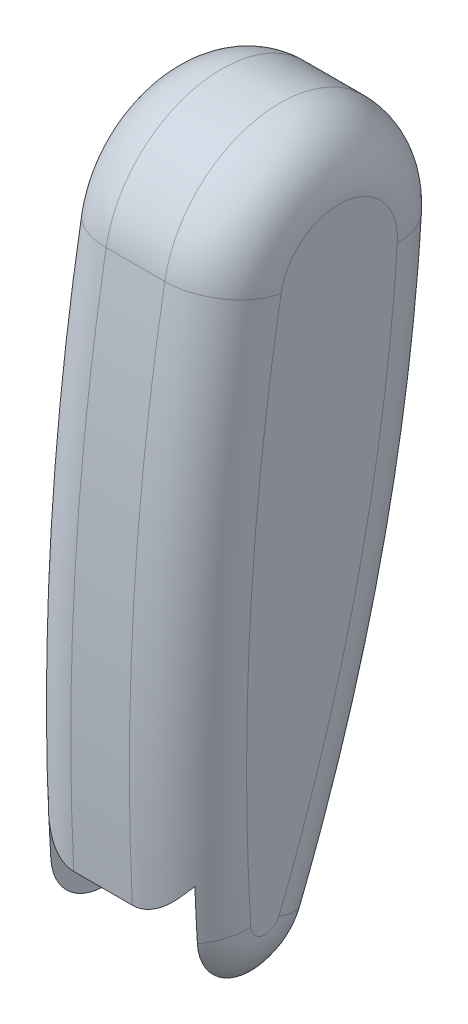
ISO-10303-21;
HEADER;
FILE_DESCRIPTION(('STEP AP214'),'2;1');
FILE_NAME('part.step','',(''),(''),'','','');
FILE_SCHEMA(('AUTOMOTIVE_DESIGN { 1 0 10303 214 1 1 1 1 }'));
ENDSEC;
DATA;
#1=APPLICATION_CONTEXT('core data for automotive mechanical design processes');
#2=APPLICATION_PROTOCOL_DEFINITION('international standard','automotive_design',2000,#1);
#3=PRODUCT_CONTEXT('',#1,'mechanical');
#4=PRODUCT('Part','Part','',(#3));
#5=PRODUCT_RELATED_PRODUCT_CATEGORY('part','',(#4));
#6=PRODUCT_DEFINITION_FORMATION('','',#4);
#7=PRODUCT_DEFINITION_CONTEXT('part definition',#1,'design');
#8=PRODUCT_DEFINITION('design','',#6,#7);
#9=PRODUCT_DEFINITION_SHAPE('','',#8);
#10=(LENGTH_UNIT() NAMED_UNIT(*) SI_UNIT(.MILLI.,.METRE.));
#11=(NAMED_UNIT(*) PLANE_ANGLE_UNIT() SI_UNIT($,.RADIAN.));
#12=(NAMED_UNIT(*) SI_UNIT($,.STERADIAN.) SOLID_ANGLE_UNIT());
#13=UNCERTAINTY_MEASURE_WITH_UNIT(LENGTH_MEASURE(1.E-05),#10,'distance_accuracy_value','');
#14=(GEOMETRIC_REPRESENTATION_CONTEXT(3) GLOBAL_UNCERTAINTY_ASSIGNED_CONTEXT((#13)) GLOBAL_UNIT_ASSIGNED_CONTEXT((#10,
#11,#12)) REPRESENTATION_CONTEXT('',''));
#15=CARTESIAN_POINT('',(0.,0.,0.));
#16=DIRECTION('',(0.,0.,1.));
#17=DIRECTION('',(1.,0.,0.));
#18=AXIS2_PLACEMENT_3D('',#15,#16,#17);
#19=CARTESIAN_POINT('',(139.7,-755.712320858886,11.4632188121573));
#20=DIRECTION('',(0.,1.,0.));
#21=DIRECTION('',(3.07606084086594E-13,0.,-1.));
#22=AXIS2_PLACEMENT_3D('',#19,#20,#21);
#23=CIRCLE('',#22,50.8000000000003);
#24=TRIMMED_CURVE('',#23,(PARAMETER_VALUE(-1.82347658193695)),
(PARAMETER_VALUE(1.82347658193694)),.T.,.PARAMETER.);
#25=CARTESIAN_POINT('',(139.699999999996,-755.712320858886,24.1632188121559));
#26=DIRECTION('',(1.,0.,3.07626936859255E-13));
#27=AXIS1_PLACEMENT('',#25,#26);
#28=SURFACE_OF_REVOLUTION('',#24,#27);
#29=CARTESIAN_POINT('',(190.499999999996,-755.712320858882,24.1632188121716));
#30=DIRECTION('',(-1.,0.,-3.07626936859255E-13));
#31=DIRECTION('',(3.1470888886976E-13,-0.371592184444044,-0.928396062281666));
#32=AXIS2_PLACEMENT_3D('',#29,#30,#31);
#33=CIRCLE('',#32,12.7000000000146);
#34=CARTESIAN_POINT('',(190.499999999999,-756.478427086324,36.8400907152899));
#35=VERTEX_POINT('',#34);
#36=CARTESIAN_POINT('',(190.5,-760.431541601326,12.3725888211803));
#37=VERTEX_POINT('',#36);
#38=EDGE_CURVE('E114',#35,#37,#33,.F.);
#39=ORIENTED_EDGE('',*,*,#38,.F.);
#40=CARTESIAN_POINT('',(139.7,-756.478427086324,36.8400907152838));
#41=DIRECTION('',(0.,0.998178890009972,0.060323324995071));
#42=DIRECTION('',(0.,-0.060323324995071,0.998178890009972));
#43=AXIS2_PLACEMENT_3D('',#40,#41,#42);
#44=CIRCLE('',#43,50.8000000000001);
#45=CARTESIAN_POINT('',(177.800000000007,-758.505353641979,70.3799411731736));
#46=VERTEX_POINT('',#45);
#47=EDGE_CURVE('E271',#46,#35,#44,.T.);
#48=ORIENTED_EDGE('',*,*,#47,.F.);
#49=CARTESIAN_POINT('',(177.800000000014,-755.712320858883,24.1632188121676));
#50=DIRECTION('',(1.,0.,3.07626936859255E-13));
#51=DIRECTION('',(3.07626936859255E-13,0.,-1.));
#52=AXIS2_PLACEMENT_3D('',#49,#50,#51);
#53=CIRCLE('',#52,46.3010416504991);
#54=CARTESIAN_POINT('',(177.800000000015,-772.917426067832,-18.8224859357094));
#55=VERTEX_POINT('',#54);
#56=EDGE_CURVE('E20',#46,#55,#53,.T.);
#57=ORIENTED_EDGE('',*,*,#56,.T.);
#58=CARTESIAN_POINT('',(139.7,-760.431541601325,12.3725888211803));
#59=DIRECTION('',(0.,0.928396062281659,-0.371592184444062));
#60=DIRECTION('',(0.,0.371592184444062,0.928396062281659));
#61=AXIS2_PLACEMENT_3D('',#58,#59,#60);
#62=CIRCLE('',#61,50.7999999999999);
#63=EDGE_CURVE('E296',#37,#55,#62,.T.);
#64=ORIENTED_EDGE('',*,*,#63,.F.);
#65=EDGE_LOOP('',(#39,#48,#57,#64));
#66=FACE_BOUND('',#65,.T.);
#67=ADVANCED_FACE('F16',(#66),#28,.F.);
#68=CARTESIAN_POINT('',(190.5,-794.216454076842,-96.8024627854969));
#69=DIRECTION('',(1.,0.,0.));
#70=DIRECTION('',(0.,0.,-1.));
#71=AXIS2_PLACEMENT_3D('',#68,#69,#70);
#72=PLANE('',#71);
#73=CARTESIAN_POINT('',(190.5,-756.478427086324,36.8400907152842));
#74=CARTESIAN_POINT('',(190.499999999999,-751.504785552898,37.1406646916831));
#75=CARTESIAN_POINT('',(190.500000000001,-746.530010340959,37.422479705629));
#76=CARTESIAN_POINT('',(190.499999999996,-736.57847566089,37.9485763175267));
#77=CARTESIAN_POINT('',(190.49999999999,-731.601716192753,38.1928579153289));
#78=CARTESIAN_POINT('',(190.499999999958,-721.646496056371,38.643872205279));
#79=CARTESIAN_POINT('',(190.499999999933,-716.668035388097,38.8506048967902));
#80=CARTESIAN_POINT('',(190.499999999804,-706.70969625621,39.2265154417653));
#81=CARTESIAN_POINT('',(190.499999999702,-701.729817792554,39.3956932941053));
#82=CARTESIAN_POINT('',(190.499999999467,-691.768925411853,39.6964628187845));
#83=CARTESIAN_POINT('',(190.499999999336,-686.787911494702,39.8280544876358));
#84=CARTESIAN_POINT('',(190.499999999232,-676.825032072229,40.0536224787717));
#85=CARTESIAN_POINT('',(190.499999999261,-671.843166566918,40.1475988015829));
#86=CARTESIAN_POINT('',(190.49999999944,-661.87886830955,40.2979363249625));
#87=CARTESIAN_POINT('',(190.499999999591,-656.896435557522,40.3542975275197));
#88=CARTESIAN_POINT('',(190.49999999986,-646.931286993145,40.4294009123427));
#89=CARTESIAN_POINT('',(190.499999999977,-641.948571180821,40.4481430980598));
#90=CARTESIAN_POINT('',(190.5,-636.965855606091,40.4480738275281));
#91=B_SPLINE_CURVE_WITH_KNOTS('',3,(#73,#74,#75,#76,#77,#78,#79,#80,#81,#82,#83,#84,#85,#86,#87,
#88,#89,#90),.UNSPECIFIED.,.F.,.F.,(4,2,2,2,2,2,2,2,4),(0.,14.9481114037877,29.8962228671435,
44.8443345839418,59.7924467480504,74.7405602993166,89.6886736413728,104.636786193134,
119.584897373515),.UNSPECIFIED.);
#92=CARTESIAN_POINT('',(190.5,-636.965855606091,40.4480738275281));
#93=VERTEX_POINT('',#92);
#94=EDGE_CURVE('E328',#35,#93,#91,.T.);
#95=ORIENTED_EDGE('',*,*,#94,.F.);
#96=ORIENTED_EDGE('',*,*,#38,.T.);
#97=CARTESIAN_POINT('',(190.5,-306.174610699949,-90.1650226153994));
#98=CARTESIAN_POINT('',(190.499999999997,-309.70473013733,-89.9413122228739));
#99=CARTESIAN_POINT('',(190.5,-313.234044049411,-89.7048925648984));
#100=CARTESIAN_POINT('',(190.499999999996,-320.290878148312,-89.2066479253229));
#101=CARTESIAN_POINT('',(190.499999999988,-323.818398335129,-88.9448229436801));
#102=CARTESIAN_POINT('',(190.49999999994,-330.871462375613,-88.3957808586758));
#103=CARTESIAN_POINT('',(190.499999999899,-334.397006229235,-88.108563754748));
#104=CARTESIAN_POINT('',(190.499999999734,-341.445933821868,-87.5087528258529));
#105=CARTESIAN_POINT('',(190.49999999961,-344.969317560786,-87.1961589997964));
#106=CARTESIAN_POINT('',(190.499999999228,-352.013746451116,-86.545609123229));
#107=CARTESIAN_POINT('',(190.49999999897,-355.534791602379,-86.2076530711065));
#108=CARTESIAN_POINT('',(190.499999998388,-360.814459727185,-85.6817149009242));
#109=CARTESIAN_POINT('',(190.499999998162,-362.574033979586,-85.5032346708977));
#110=CARTESIAN_POINT('',(190.499999997686,-366.092520210183,-85.1399365299907));
#111=CARTESIAN_POINT('',(190.499999997437,-367.851432191284,-84.9551186472364));
#112=CARTESIAN_POINT('',(190.499999996788,-373.1271502168,-84.3911518240128));
#113=CARTESIAN_POINT('',(190.499999996488,-376.642944023808,-84.0024891427665));
#114=CARTESIAN_POINT('',(190.499999996252,-383.671634070497,-83.1998221977133));
#115=CARTESIAN_POINT('',(190.499999996315,-387.184530310282,-82.7858179348245));
#116=CARTESIAN_POINT('',(190.499999996783,-394.20724592969,-81.9324812289642));
#117=CARTESIAN_POINT('',(190.499999997188,-397.717065309614,-81.4931487884746));
#118=CARTESIAN_POINT('',(190.499999998166,-404.733445260621,-80.5892030496749));
#119=CARTESIAN_POINT('',(190.49999999874,-408.240005832225,-80.1245897554033));
#120=CARTESIAN_POINT('',(190.499999999622,-415.249678743445,-79.1700169080272));
#121=CARTESIAN_POINT('',(190.499999999931,-418.752791083825,-78.6800573605372));
#122=CARTESIAN_POINT('',(190.500000000032,-423.854992269642,-77.9478697756917));
#123=CARTESIAN_POINT('',(190.500000000013,-425.455506036285,-77.7155233647591));
#124=CARTESIAN_POINT('',(190.499999999968,-430.840104051607,-76.9247940099995));
#125=CARTESIAN_POINT('',(190.499999999964,-434.622420916639,-76.3543164070526));
#126=CARTESIAN_POINT('',(190.499999999795,-442.669278707074,-75.1085634965419));
#127=CARTESIAN_POINT('',(190.499999999609,-446.933194520451,-74.4292532108432));
#128=CARTESIAN_POINT('',(190.499999999086,-455.982716549015,-72.9466914252802));
#129=CARTESIAN_POINT('',(190.499999998734,-460.767516574176,-72.138510795333));
#130=CARTESIAN_POINT('',(190.499999998244,-468.878669030538,-70.7272122344266));
#131=CARTESIAN_POINT('',(190.499999998073,-472.207142562083,-70.1362574797092));
#132=CARTESIAN_POINT('',(190.499999997949,-477.032245717333,-69.2624270944441));
#133=CARTESIAN_POINT('',(190.499999997927,-478.530532427363,-68.988683671324));
#134=CARTESIAN_POINT('',(190.499999997913,-481.773178098443,-68.3910368030013));
#135=CARTESIAN_POINT('',(190.499999997925,-483.517384171231,-68.0663037886801));
#136=CARTESIAN_POINT('',(190.499999997991,-488.748223717328,-67.0826522195299));
#137=CARTESIAN_POINT('',(190.499999998076,-492.233084304436,-66.4142800936985));
#138=CARTESIAN_POINT('',(190.499999998325,-499.19787949983,-65.0523634658241));
#139=CARTESIAN_POINT('',(190.499999998489,-502.677814108359,-64.3588189650301));
#140=CARTESIAN_POINT('',(190.499999998854,-509.632579377982,-62.9465901960604));
#141=CARTESIAN_POINT('',(190.499999999055,-513.107410039437,-62.2279059296626));
#142=CARTESIAN_POINT('',(190.499999999445,-520.051785991824,-60.7654475847714));
#143=CARTESIAN_POINT('',(190.499999999634,-523.52133128324,-60.0216735085819));
#144=CARTESIAN_POINT('',(190.499999999902,-530.454950284098,-58.5090285523557));
#145=CARTESIAN_POINT('',(190.49999999998,-533.919023994158,-57.7401576751532));
#146=CARTESIAN_POINT('',(190.50000000001,-539.137199301927,-56.562252805714));
#147=CARTESIAN_POINT('',(190.500000000006,-540.893391742788,-56.1624556804964));
#148=CARTESIAN_POINT('',(190.499999999985,-546.351325096826,-54.9094370253544));
#149=CARTESIAN_POINT('',(190.49999999996,-550.050526161768,-54.0451252575374));
#150=CARTESIAN_POINT('',(190.499999999777,-557.79361814368,-52.2043554382184));
#151=CARTESIAN_POINT('',(190.499999999605,-561.836832638211,-51.22504923819));
#152=CARTESIAN_POINT('',(190.499999999303,-566.872162012575,-49.9828412954972));
#153=CARTESIAN_POINT('',(190.499999999239,-567.868256146791,-49.7360020233007));
#154=CARTESIAN_POINT('',(190.499999998931,-572.577068220059,-48.5638986307951));
#155=CARTESIAN_POINT('',(190.499999998671,-576.286455432389,-47.6252007908515));
#156=CARTESIAN_POINT('',(190.499999998246,-583.266071261498,-45.8299621602187));
#157=CARTESIAN_POINT('',(190.499999998074,-586.537115968202,-44.9765906863336));
#158=CARTESIAN_POINT('',(190.499999997949,-591.277606067217,-43.7224028414335));
#159=CARTESIAN_POINT('',(190.499999997928,-592.749428849927,-43.330558454205));
#160=CARTESIAN_POINT('',(190.499999997913,-595.934385204853,-42.477330276163));
#161=CARTESIAN_POINT('',(190.499999997925,-597.647300514441,-42.0151316845708));
#162=CARTESIAN_POINT('',(190.499999997991,-602.783522831322,-40.6192544461812));
#163=CARTESIAN_POINT('',(190.499999998076,-606.204311911565,-39.6762928348391));
#164=CARTESIAN_POINT('',(190.499999998325,-613.038980960608,-37.7656678429772));
#165=CARTESIAN_POINT('',(190.499999998489,-616.452860929751,-36.7980044636829));
#166=CARTESIAN_POINT('',(190.499999998854,-623.273536921152,-34.8380225582955));
#167=CARTESIAN_POINT('',(190.499999999055,-626.680332943911,-33.845704033946));
#168=CARTESIAN_POINT('',(190.499999999445,-633.486664162714,-31.8364760682219));
#169=CARTESIAN_POINT('',(190.499999999634,-636.886199359426,-30.8195666291053));
#170=CARTESIAN_POINT('',(190.499999999902,-643.677822749352,-28.7611645552476));
#171=CARTESIAN_POINT('',(190.49999999998,-647.069910943407,-27.7196719232828));
#172=CARTESIAN_POINT('',(190.50000000001,-652.165073734798,-26.1352065639179));
#173=CARTESIAN_POINT('',(190.500000000006,-653.870980730381,-25.6013227269587));
#174=CARTESIAN_POINT('',(190.499999999985,-659.188897828419,-23.9263965713678));
#175=CARTESIAN_POINT('',(190.499999999962,-662.797505932397,-22.7745327150016));
#176=CARTESIAN_POINT('',(190.499999999786,-670.353793871321,-20.3304241335073));
#177=CARTESIAN_POINT('',(190.499999999621,-674.300564075223,-19.0353650131091));
#178=CARTESIAN_POINT('',(190.499999999332,-679.211170792909,-17.4010052093507));
#179=CARTESIAN_POINT('',(190.499999999271,-680.180234477885,-17.0773590322386));
#180=CARTESIAN_POINT('',(190.499999998976,-684.76300871683,-15.5415089766381));
#181=CARTESIAN_POINT('',(190.499999998728,-688.372366484974,-14.31627724706));
#182=CARTESIAN_POINT('',(190.499999998324,-695.165189610933,-11.980932974828));
#183=CARTESIAN_POINT('',(190.499999998161,-698.349702966122,-10.8738661164288));
#184=CARTESIAN_POINT('',(190.499999998045,-702.964981335113,-9.25161281662572));
#185=CARTESIAN_POINT('',(190.499999998026,-704.398809312934,-8.74512980787549));
#186=CARTESIAN_POINT('',(190.499999998015,-707.498544151049,-7.644779858674));
#187=CARTESIAN_POINT('',(190.499999998027,-709.164173057291,-7.05012986161625));
#188=CARTESIAN_POINT('',(190.499999998094,-714.157828912948,-5.25718471473911));
#189=CARTESIAN_POINT('',(190.499999998176,-717.482630493281,-4.04989248120522));
#190=CARTESIAN_POINT('',(190.499999998415,-724.123444362712,-1.61138227816989));
#191=CARTESIAN_POINT('',(190.499999998571,-727.439456652234,-0.380164309820378));
#192=CARTESIAN_POINT('',(190.499999998918,-734.06252384506,2.10613439525593));
#193=CARTESIAN_POINT('',(190.499999999109,-737.369578748978,3.36121513034793));
#194=CARTESIAN_POINT('',(190.499999999476,-743.974558268403,5.8951739741439));
#195=CARTESIAN_POINT('',(190.499999999651,-747.27248288472,7.17405208073301));
#196=CARTESIAN_POINT('',(190.499999999912,-753.859030840326,9.7555390243751));
#197=CARTESIAN_POINT('',(190.499999999997,-757.14765418063,11.0581478588359));
#198=CARTESIAN_POINT('',(190.5,-760.431541601325,12.3725888211799));
#199=B_SPLINE_CURVE_WITH_KNOTS('',3,(#97,#98,#99,#100,#101,#102,#103,#104,#105,#106,#107,#108,
#109,#110,#111,#112,#113,#114,#115,#116,#117,#118,#119,#120,#121,#122,#123,#124,#125,#126,#127,
#128,#129,#130,#131,#132,#133,#134,#135,#136,#137,#138,#139,#140,#141,#142,#143,#144,#145,#146,
#147,#148,#149,#150,#151,#152,#153,#154,#155,#156,#157,#158,#159,#160,#161,#162,#163,#164,#165,
#166,#167,#168,#169,#170,#171,#172,#173,#174,#175,#176,#177,#178,#179,#180,#181,#182,#183,#184,
#185,#186,#187,#188,#189,#190,#191,#192,#193,#194,#195,#196,#197,#198),.UNSPECIFIED.,.F.,.F.,(4,
2,2,2,2,2,2,2,2,2,2,2,2,2,2,2,2,2,2,2,2,2,2,2,2,2,2,2,2,2,2,2,2,2,2,2,2,2,2,2,2,2,2,2,2,2,2,2,2,
2,4),(0.,10.6115792854472,21.2231585887521,31.8347381287222,42.4463181241656,53.0578987938936,
58.3636980459442,63.6694737541819,74.2810080455923,84.8925419526014,95.5040748198274,
106.115605991893,116.727134813418,121.579001870633,133.054164253926,146.007072222298,
160.5645394405,170.706041007941,175.275299953863,180.597822886132,191.242851112167,
201.887878810071,212.532905755152,223.17793172272,233.822956488088,239.226321803955,
250.622699248777,263.102898097303,266.1815661697,277.660385257751,287.801890713519,
292.371155489787,297.693678419792,308.338706641319,318.983734334739,329.628761275364,
340.27378723851,350.918811999489,356.281299188003,367.645142037221,380.106415235886,
383.171456876194,394.606266779599,404.720556874874,409.282511651589,414.588286671126,
425.199819243212,435.811351304392,446.422882638597,457.034413029761,467.645942261815),.UNSPECIFIED.);
#200=CARTESIAN_POINT('',(190.5,-306.174610699949,-90.1650226153989));
#201=VERTEX_POINT('',#200);
#202=EDGE_CURVE('E300',#201,#37,#199,.T.);
#203=ORIENTED_EDGE('',*,*,#202,.F.);
#204=CARTESIAN_POINT('',(190.5,-302.961759830239,-39.46672294678));
#205=DIRECTION('',(-1.,0.,0.));
#206=DIRECTION('',(0.,-1.,0.));
#207=AXIS2_PLACEMENT_3D('',#204,#205,#206);
#208=CIRCLE('',#207,50.7999999999992);
#209=CARTESIAN_POINT('',(190.5,-294.172178362454,10.5670981907371));
#210=VERTEX_POINT('',#209);
#211=EDGE_CURVE('E253',#210,#201,#208,.T.);
#212=ORIENTED_EDGE('',*,*,#211,.F.);
#213=CARTESIAN_POINT('',(190.500000000005,-636.965855606092,-1940.75192617248));
#214=DIRECTION('',(-1.,0.,0.));
#215=DIRECTION('',(0.,0.,1.));
#216=AXIS2_PLACEMENT_3D('',#213,#214,#215);
#217=CIRCLE('',#216,1981.20000000001);
#218=EDGE_CURVE('E254',#93,#210,#217,.T.);
#219=ORIENTED_EDGE('',*,*,#218,.F.);
#220=EDGE_LOOP('',(#95,#96,#203,#212,#219));
#221=FACE_BOUND('',#220,.T.);
#222=ADVANCED_FACE('F273',(#221),#72,.T.);
#223=CARTESIAN_POINT('',(177.8,-755.712320858886,24.1632188121575));
#224=DIRECTION('',(1.,0.,0.));
#225=DIRECTION('',(0.,0.,-1.));
#226=AXIS2_PLACEMENT_3D('',#223,#224,#225);
#227=PLANE('',#226);
#228=ORIENTED_EDGE('',*,*,#56,.F.);
#229=CARTESIAN_POINT('',(177.8,-636.965855606091,-1940.75192617248));
#230=DIRECTION('',(-1.,0.,0.));
#231=DIRECTION('',(0.,0.,1.));
#232=AXIS2_PLACEMENT_3D('',#229,#230,#231);
#233=CIRCLE('',#232,2014.80104165053);
#234=CARTESIAN_POINT('',(177.8,-714.594540159553,72.5530742610243));
#235=VERTEX_POINT('',#234);
#236=EDGE_CURVE('E325',#235,#46,#233,.F.);
#237=ORIENTED_EDGE('',*,*,#236,.F.);
#238=CARTESIAN_POINT('',(177.8,-755.712320858886,24.1632188121575));
#239=DIRECTION('',(1.,0.,0.));
#240=DIRECTION('',(0.,0.,-1.));
#241=AXIS2_PLACEMENT_3D('',#238,#239,#240);
#242=CIRCLE('',#241,63.5);
#243=CARTESIAN_POINT('',(177.8,-731.702261045361,-34.6225535120278));
#244=VERTEX_POINT('',#243);
#245=EDGE_CURVE('E409',#235,#244,#242,.F.);
#246=ORIENTED_EDGE('',*,*,#245,.T.);
#247=CARTESIAN_POINT('',(177.800000000004,-213.001935478344,1380.08566777453));
#248=DIRECTION('',(-1.,0.,0.));
#249=DIRECTION('',(0.,0.,1.));
#250=AXIS2_PLACEMENT_3D('',#247,#248,#249);
#251=CIRCLE('',#250,1506.80104165052);
#252=EDGE_CURVE('E299',#55,#244,#251,.F.);
#253=ORIENTED_EDGE('',*,*,#252,.F.);
#254=EDGE_LOOP('',(#228,#237,#246,#253));
#255=FACE_BOUND('',#254,.T.);
#256=ADVANCED_FACE('F283',(#255),#227,.F.);
#257=CARTESIAN_POINT('',(139.700000000003,-213.001935478344,1380.08566777453));
#258=DIRECTION('',(-1.,0.,0.));
#259=DIRECTION('',(0.,0.,1.));
#260=AXIS2_PLACEMENT_3D('',#257,#258,#259);
#261=TOROIDAL_SURFACE('',#260,1473.2,50.7999999999999);
#262=ORIENTED_EDGE('',*,*,#252,.T.);
#263=CARTESIAN_POINT('',(177.8,-731.702261045361,-34.6225535120279));
#264=CARTESIAN_POINT('',(177.272065938747,-732.524849895569,-34.9585145249549));
#265=CARTESIAN_POINT('',(176.73436169016,-733.34902760362,-35.2750026802369));
#266=CARTESIAN_POINT('',(175.642014145145,-734.99805619701,-35.8695771211048));
#267=CARTESIAN_POINT('',(175.087397822279,-735.822904157695,-36.1477210138592));
#268=CARTESIAN_POINT('',(173.96222796631,-737.473253110639,-36.6671583168188));
#269=CARTESIAN_POINT('',(173.391674867184,-738.298754084523,-36.9084527293222));
#270=CARTESIAN_POINT('',(172.235265175111,-739.950636860829,-37.3554956349533));
#271=CARTESIAN_POINT('',(171.64938662061,-740.777018092656,-37.5611894914661));
#272=CARTESIAN_POINT('',(171.057040913688,-741.602683861437,-37.7493658843338));
#273=B_SPLINE_CURVE_WITH_KNOTS('',3,(#263,#264,#265,#266,#267,#268,#269,#270,#271,#272),
.UNSPECIFIED.,.F.,.F.,(4,2,2,2,4),(0.,3.10032779302815,6.19594577568065,9.29147954315921,
12.3917227310583),.UNSPECIFIED.);
#274=CARTESIAN_POINT('',(171.057040913688,-741.602683861437,-37.7493658843338));
#275=VERTEX_POINT('',#274);
#276=EDGE_CURVE('E235',#244,#275,#273,.T.);
#277=ORIENTED_EDGE('',*,*,#276,.T.);
#278=CARTESIAN_POINT('',(171.057040913688,-741.602683861437,-37.7493658843338));
#279=CARTESIAN_POINT('',(170.679393338726,-742.129054709324,-37.8693237511574));
#280=CARTESIAN_POINT('',(170.294174973053,-742.650295975597,-37.9881126063031));
#281=CARTESIAN_POINT('',(169.508053628174,-743.681525873199,-38.2231258849024));
#282=CARTESIAN_POINT('',(169.107148308394,-744.191512807433,-38.3393499215947));
#283=CARTESIAN_POINT('',(168.288408452028,-745.200085485432,-38.5691997080618));
#284=CARTESIAN_POINT('',(167.870541792489,-745.698646502451,-38.6828198227073));
#285=CARTESIAN_POINT('',(167.018203713189,-746.682020452603,-38.9069269172086));
#286=CARTESIAN_POINT('',(166.583732951725,-747.166833929456,-39.0174140209759));
#287=CARTESIAN_POINT('',(165.239256989233,-748.615314244766,-39.3475170452184));
#288=CARTESIAN_POINT('',(164.302280230341,-749.555509199954,-39.5617838148835));
#289=CARTESIAN_POINT('',(162.354898309919,-751.359565851587,-39.9729213017476));
#290=CARTESIAN_POINT('',(161.344551312953,-752.223486836178,-40.1698055304841));
#291=CARTESIAN_POINT('',(159.515734927459,-753.650549190896,-40.4950274848978));
#292=CARTESIAN_POINT('',(158.714087135514,-754.234190159631,-40.6280369892829));
#293=CARTESIAN_POINT('',(157.068848299237,-755.342706667587,-40.8806635854689));
#294=CARTESIAN_POINT('',(156.225255777033,-755.867580134086,-41.0002802049041));
#295=CARTESIAN_POINT('',(154.505179366097,-756.845581536386,-41.2231629166678));
#296=CARTESIAN_POINT('',(153.62905040581,-757.299300391707,-41.3265636772541));
#297=CARTESIAN_POINT('',(151.839914120481,-758.13162983194,-41.5162483160322));
#298=CARTESIAN_POINT('',(150.926911989194,-758.510250950608,-41.6025345948261));
#299=CARTESIAN_POINT('',(149.181874031108,-759.142729747431,-41.7466740500837));
#300=CARTESIAN_POINT('',(148.353484231773,-759.406158154392,-41.8067083583793));
#301=CARTESIAN_POINT('',(146.676579088849,-759.862928110649,-41.9108044529894));
#302=CARTESIAN_POINT('',(145.828068849541,-760.056287237124,-41.9548702450749));
#303=CARTESIAN_POINT('',(144.538438648629,-760.29166111102,-42.0085110345144));
#304=CARTESIAN_POINT('',(144.102459730862,-760.361315303532,-42.0243849537911));
#305=CARTESIAN_POINT('',(143.227654124069,-760.481065530064,-42.0516755641736));
#306=CARTESIAN_POINT('',(142.788827460395,-760.531161737959,-42.0630922949049));
#307=CARTESIAN_POINT('',(141.908833204994,-760.611495437214,-42.081400032188));
#308=CARTESIAN_POINT('',(141.467663728598,-760.641713256707,-42.0882865555983));
#309=CARTESIAN_POINT('',(140.584332723726,-760.682046217662,-42.0974782803647));
#310=CARTESIAN_POINT('',(140.142171135385,-760.692160111497,-42.0997831973916));
#311=CARTESIAN_POINT('',(139.7,-760.692137678098,-42.0997780849073));
#312=B_SPLINE_CURVE_WITH_KNOTS('',3,(#278,#279,#280,#281,#282,#283,#284,#285,#286,#287,#288,
#289,#290,#291,#292,#293,#294,#295,#296,#297,#298,#299,#300,#301,#302,#303,#304,#305,#306,#307,
#308,#309,#310,#311),.UNSPECIFIED.,.F.,.F.,(4,2,2,2,2,2,2,2,2,2,2,2,2,2,2,2,4),(0.,
1.97650363345683,3.9533033043886,5.93403957033883,7.91469738804664,11.944357165666,
15.9708565721302,18.969944396178,21.9691379644584,24.9419287905112,27.9143023358996,
30.5254171734336,33.1358765474155,34.4608718177135,35.7858553081999,37.1121480518296,
38.4385231011236),.UNSPECIFIED.);
#313=CARTESIAN_POINT('',(139.7,-760.692137678098,-42.0997780849073));
#314=VERTEX_POINT('',#313);
#315=EDGE_CURVE('E240',#275,#314,#312,.T.);
#316=ORIENTED_EDGE('',*,*,#315,.T.);
#317=CARTESIAN_POINT('',(139.7,-213.001935478344,1380.08566777453));
#318=DIRECTION('',(-1.,0.,0.));
#319=DIRECTION('',(0.,0.,1.));
#320=AXIS2_PLACEMENT_3D('',#317,#318,#319);
#321=CIRCLE('',#320,1524.);
#322=CARTESIAN_POINT('',(139.7,-309.38746156966,-140.863322284018));
#323=VERTEX_POINT('',#322);
#324=EDGE_CURVE('E239',#323,#314,#321,.T.);
#325=ORIENTED_EDGE('',*,*,#324,.F.);
#326=CARTESIAN_POINT('',(139.7,-306.17461069995,-90.1650226153996));
#327=DIRECTION('',(0.,0.997998024972797,-0.0632450958604385));
#328=DIRECTION('',(0.,0.0632450958604385,0.997998024972797));
#329=AXIS2_PLACEMENT_3D('',#326,#327,#328);
#330=CIRCLE('',#329,50.8000000000001);
#331=EDGE_CURVE('E262',#201,#323,#330,.T.);
#332=ORIENTED_EDGE('',*,*,#331,.F.);
#333=ORIENTED_EDGE('',*,*,#202,.T.);
#334=ORIENTED_EDGE('',*,*,#63,.T.);
#335=EDGE_LOOP('',(#262,#277,#316,#325,#332,#333,#334));
#336=FACE_BOUND('',#335,.T.);
#337=ADVANCED_FACE('F289',(#336),#261,.T.);
#338=CARTESIAN_POINT('',(139.700000000005,-636.965855606092,-1940.75192617248));
#339=DIRECTION('',(-1.,0.,0.));
#340=DIRECTION('',(0.,0.,1.));
#341=AXIS2_PLACEMENT_3D('',#338,#339,#340);
#342=TOROIDAL_SURFACE('',#341,1981.20000000001,50.8000000000001);
#343=ORIENTED_EDGE('',*,*,#218,.T.);
#344=CARTESIAN_POINT('',(139.7,-294.172178362454,10.5670981907372));
#345=DIRECTION('',(0.,0.984917738927523,-0.173023257239873));
#346=DIRECTION('',(0.,0.173023257239873,0.984917738927523));
#347=AXIS2_PLACEMENT_3D('',#344,#345,#346);
#348=CIRCLE('',#347,50.8000000000001);
#349=CARTESIAN_POINT('',(139.7,-285.382596894668,60.6009193282553));
#350=VERTEX_POINT('',#349);
#351=EDGE_CURVE('E250',#350,#210,#348,.T.);
#352=ORIENTED_EDGE('',*,*,#351,.F.);
#353=CARTESIAN_POINT('',(139.7,-636.965855606091,-1940.75192617247));
#354=DIRECTION('',(-1.,0.,0.));
#355=DIRECTION('',(0.,0.,1.));
#356=AXIS2_PLACEMENT_3D('',#353,#354,#355);
#357=CIRCLE('',#356,2032.);
#358=CARTESIAN_POINT('',(139.7,-739.573578609132,88.655784264278));
#359=VERTEX_POINT('',#358);
#360=EDGE_CURVE('E214',#359,#350,#357,.T.);
#361=ORIENTED_EDGE('',*,*,#360,.F.);
#362=CARTESIAN_POINT('',(139.7,-739.573578609132,88.6557842642778));
#363=CARTESIAN_POINT('',(140.20567385634,-739.573611567676,88.6558042819151));
#364=CARTESIAN_POINT('',(140.711331600541,-739.562088612385,88.6488057222135));
#365=CARTESIAN_POINT('',(141.72117511523,-739.516177342122,88.6209211424513));
#366=CARTESIAN_POINT('',(142.225361028344,-739.481791321908,88.6000365161309));
#367=CARTESIAN_POINT('',(143.230200626406,-739.390465968027,88.5445693269206));
#368=CARTESIAN_POINT('',(143.730858346283,-739.333559117158,88.5100064927196));
#369=CARTESIAN_POINT('',(144.728014722033,-739.197684731444,88.4274820902289));
#370=CARTESIAN_POINT('',(145.224513325043,-739.118716916634,88.3795203519008));
#371=CARTESIAN_POINT('',(146.688771436619,-738.852708209658,88.2179578212946));
#372=CARTESIAN_POINT('',(147.649102785999,-738.634899313364,88.0856698339061));
#373=CARTESIAN_POINT('',(149.541157044788,-738.122393495667,87.7743952978261));
#374=CARTESIAN_POINT('',(150.472871985725,-737.827675371375,87.5953958713884));
#375=CARTESIAN_POINT('',(152.296301929708,-737.17067379777,87.1963606741942));
#376=CARTESIAN_POINT('',(153.188224954719,-736.80881021675,86.9765799138266));
#377=CARTESIAN_POINT('',(154.934211905564,-736.023940112498,86.4998827346957));
#378=CARTESIAN_POINT('',(155.788276446729,-735.60093458351,86.2429669197947));
#379=CARTESIAN_POINT('',(157.463423811938,-734.697438276887,85.6942211612423));
#380=CARTESIAN_POINT('',(158.284176064929,-734.216501669772,85.4021204394664));
#381=CARTESIAN_POINT('',(159.884346921446,-733.207021240596,84.78900437049));
#382=CARTESIAN_POINT('',(160.66376560767,-732.678477513789,84.4679890811431));
#383=CARTESIAN_POINT('',(162.3696140017,-731.44394062917,83.7181831613569));
#384=CARTESIAN_POINT('',(163.28462706213,-730.726425666431,83.2823946698995));
#385=CARTESIAN_POINT('',(165.052810086117,-729.237349708856,82.3779923941061));
#386=CARTESIAN_POINT('',(165.905947524272,-728.465760702612,81.9093615968159));
#387=CARTESIAN_POINT('',(167.540137020854,-726.889630413368,80.952086171551));
#388=CARTESIAN_POINT('',(168.322087182649,-726.085767679642,80.4638536659426));
#389=CARTESIAN_POINT('',(169.45321110565,-724.853117704156,79.715193775616));
#390=CARTESIAN_POINT('',(169.823060264191,-724.438034958513,79.4630899269895));
#391=CARTESIAN_POINT('',(170.549399245202,-723.599485475763,78.9537901449958));
#392=CARTESIAN_POINT('',(170.905890570149,-723.17601968981,78.6965947893204));
#393=CARTESIAN_POINT('',(171.255933121707,-722.748675938704,78.4370441202761));
#394=B_SPLINE_CURVE_WITH_KNOTS('',3,(#362,#363,#364,#365,#366,#367,#368,#369,#370,#371,#372,
#373,#374,#375,#376,#377,#378,#379,#380,#381,#382,#383,#384,#385,#386,#387,#388,#389,#390,#391,
#392,#393),.UNSPECIFIED.,.F.,.F.,(4,2,2,2,2,2,2,2,2,2,2,2,2,2,2,4),(0.,1.51681421787701,
3.03347621656222,4.54795859250236,6.06246018881668,9.03796746516794,12.0142959190192,
14.9726045872968,17.9308651552103,20.9135528698226,23.8962346166534,27.6178490836779,
31.3414058766686,35.008403773221,36.8395404386402,38.6704705173085),.UNSPECIFIED.);
#395=CARTESIAN_POINT('',(171.255933121707,-722.748675938704,78.4370441202762));
#396=VERTEX_POINT('',#395);
#397=EDGE_CURVE('E230',#359,#396,#394,.T.);
#398=ORIENTED_EDGE('',*,*,#397,.T.);
#399=CARTESIAN_POINT('',(171.255933121707,-722.748675938704,78.4370441202762));
#400=CARTESIAN_POINT('',(171.830239070947,-722.047515583188,78.0111779657199));
#401=CARTESIAN_POINT('',(172.398358265505,-721.350845376358,77.5694600336573));
#402=CARTESIAN_POINT('',(173.519998756699,-719.968663812184,76.6544298431773));
#403=CARTESIAN_POINT('',(174.073539795381,-719.28313790196,76.1811637408667));
#404=CARTESIAN_POINT('',(175.16546687296,-717.923390689603,75.201916968627));
#405=CARTESIAN_POINT('',(175.703852519529,-717.249169680302,74.6959354529098));
#406=CARTESIAN_POINT('',(176.764587802683,-715.91245275832,73.6499993406035));
#407=CARTESIAN_POINT('',(177.28691333037,-715.249975050641,73.1099970557224));
#408=CARTESIAN_POINT('',(177.8,-714.594540159561,72.5530742610241));
#409=B_SPLINE_CURVE_WITH_KNOTS('',3,(#399,#400,#401,#402,#403,#404,#405,#406,#407,#408),
.UNSPECIFIED.,.F.,.F.,(4,2,2,2,4),(0.,3.00413592356552,6.00396926312413,9.00388018808469,
12.0080940343042),.UNSPECIFIED.);
#410=EDGE_CURVE('E410',#396,#235,#409,.T.);
#411=ORIENTED_EDGE('',*,*,#410,.T.);
#412=ORIENTED_EDGE('',*,*,#236,.T.);
#413=ORIENTED_EDGE('',*,*,#47,.T.);
#414=ORIENTED_EDGE('',*,*,#94,.T.);
#415=EDGE_LOOP('',(#343,#352,#361,#398,#411,#412,#413,#414));
#416=FACE_BOUND('',#415,.T.);
#417=ADVANCED_FACE('F417',(#416),#342,.T.);
#418=CARTESIAN_POINT('',(139.7,-302.961759830239,-39.46672294678));
#419=DIRECTION('',(-1.,0.,0.));
#420=DIRECTION('',(0.,-1.,0.));
#421=AXIS2_PLACEMENT_3D('',#418,#419,#420);
#422=DEGENERATE_TOROIDAL_SURFACE('',#421,50.799999999999,50.8000000000001,.T.);
#423=ORIENTED_EDGE('',*,*,#211,.T.);
#424=ORIENTED_EDGE('',*,*,#331,.T.);
#425=CARTESIAN_POINT('',(139.7,-302.961759830239,-39.4667229467813));
#426=DIRECTION('',(-1.,0.,0.));
#427=DIRECTION('',(0.,0.,1.));
#428=AXIS2_PLACEMENT_3D('',#425,#426,#427);
#429=CIRCLE('',#428,101.6);
#430=EDGE_CURVE('E219',#350,#323,#429,.T.);
#431=ORIENTED_EDGE('',*,*,#430,.F.);
#432=ORIENTED_EDGE('',*,*,#351,.T.);
#433=EDGE_LOOP('',(#423,#424,#431,#432));
#434=FACE_BOUND('',#433,.T.);
#435=ADVANCED_FACE('F344',(#434),#422,.T.);
#436=CARTESIAN_POINT('',(50.8,-741.602683861437,-37.7493658843339));
#437=DIRECTION('',(0.,0.22219900783384,-0.975001333803014));
#438=DIRECTION('',(0.,0.975001333803014,0.22219900783384));
#439=AXIS2_PLACEMENT_3D('',#436,#437,#438);
#440=PLANE('',#439);
#441=DIRECTION('',(-1.,0.,0.));
#442=VECTOR('',#441,1.);
#443=CARTESIAN_POINT('',(190.5,-760.692137678098,-42.0997780849073));
#444=LINE('',#443,#442);
#445=CARTESIAN_POINT('',(88.9000000000001,-760.692137678098,-42.0997780849072));
#446=VERTEX_POINT('',#445);
#447=EDGE_CURVE('E236',#314,#446,#444,.T.);
#448=ORIENTED_EDGE('',*,*,#447,.F.);
#449=ORIENTED_EDGE('',*,*,#315,.F.);
#450=DIRECTION('',(1.,0.,0.));
#451=VECTOR('',#450,1.);
#452=CARTESIAN_POINT('',(50.8,-741.602683861437,-37.7493658843339));
#453=LINE('',#452,#451);
#454=CARTESIAN_POINT('',(57.542959086312,-741.602683861437,-37.7493658843338));
#455=VERTEX_POINT('',#454);
#456=EDGE_CURVE('E233',#275,#455,#453,.F.);
#457=ORIENTED_EDGE('',*,*,#456,.T.);
#458=CARTESIAN_POINT('',(88.9,-760.692137678097,-42.0997780849071));
#459=CARTESIAN_POINT('',(88.3965570644075,-760.692175329729,-42.0997866655673));
#460=CARTESIAN_POINT('',(87.8931302759231,-760.67905596267,-42.0967968128946));
#461=CARTESIAN_POINT('',(86.8877495748404,-760.626784771601,-42.0848844119663));
#462=CARTESIAN_POINT('',(86.3857955184436,-760.587635580296,-42.0759624636942));
#463=CARTESIAN_POINT('',(85.3854231594791,-760.483661535681,-42.0522671837465));
#464=CARTESIAN_POINT('',(84.8870007900591,-760.418873936991,-42.0375023422536));
#465=CARTESIAN_POINT('',(83.8943167541852,-760.264185813448,-42.0022495211719));
#466=CARTESIAN_POINT('',(83.4000551409545,-760.174284967854,-41.9817614684875));
#467=CARTESIAN_POINT('',(81.942523530684,-759.871472681982,-41.9127517275281));
#468=CARTESIAN_POINT('',(80.9866823595575,-759.623548235907,-41.8562507115545));
#469=CARTESIAN_POINT('',(79.103604935498,-759.040220038943,-41.7233124866382));
#470=CARTESIAN_POINT('',(78.1763767040534,-758.704792001608,-41.6468697429089));
#471=CARTESIAN_POINT('',(76.3619177760409,-757.957107166936,-41.4764752801767));
#472=CARTESIAN_POINT('',(75.4744776841497,-757.545331259569,-41.3826331541255));
#473=CARTESIAN_POINT('',(73.7374239088982,-756.652271762612,-41.1791083718706));
#474=CARTESIAN_POINT('',(72.8878096147048,-756.170989295987,-41.0694259715865));
#475=CARTESIAN_POINT('',(71.2215254041027,-755.143085533419,-40.8351707062112));
#476=CARTESIAN_POINT('',(70.4051867621075,-754.595955926847,-40.7104819991069));
#477=CARTESIAN_POINT('',(68.8137732938093,-753.447627176681,-40.4487823479293));
#478=CARTESIAN_POINT('',(68.0386983505732,-752.846428186322,-40.3117714387775));
#479=CARTESIAN_POINT('',(66.3461809824246,-751.445336276268,-39.9924680475875));
#480=CARTESIAN_POINT('',(65.4398826004528,-750.632649739977,-39.8072599501387));
#481=CARTESIAN_POINT('',(63.6884759851334,-748.946413175346,-39.4229732023734));
#482=CARTESIAN_POINT('',(62.8433995762711,-748.072831949073,-39.2238874421691));
#483=CARTESIAN_POINT('',(61.2245726325658,-746.288670532386,-38.8172840018877));
#484=CARTESIAN_POINT('',(60.4499321337916,-745.378856031739,-38.6099408195272));
#485=CARTESIAN_POINT('',(59.3292675201135,-743.983905157541,-38.2920369464988));
#486=CARTESIAN_POINT('',(58.962817073384,-743.514194153256,-38.1849916374288));
#487=CARTESIAN_POINT('',(58.2431097294118,-742.565337075762,-37.9687508038158));
#488=CARTESIAN_POINT('',(57.889851353562,-742.086192069194,-37.8595555223563));
#489=CARTESIAN_POINT('',(57.5429590863123,-741.602683861437,-37.7493658843338));
#490=B_SPLINE_CURVE_WITH_KNOTS('',3,(#458,#459,#460,#461,#462,#463,#464,#465,#466,#467,#468,
#469,#470,#471,#472,#473,#474,#475,#476,#477,#478,#479,#480,#481,#482,#483,#484,#485,#486,#487,
#488,#489),.UNSPECIFIED.,.F.,.F.,(4,2,2,2,2,2,2,2,2,2,2,2,2,2,2,4),(0.,1.51012130218705,
3.02008989106739,4.52787238637247,6.03567413960129,8.99773661548253,11.960622082168,
14.9054429820409,17.8502163099694,20.8193878162225,23.7885509079842,27.4788649373542,
31.1710837070132,34.807095188288,36.6227742725125,38.4382492353663),.UNSPECIFIED.);
#491=EDGE_CURVE('E247',#446,#455,#490,.T.);
#492=ORIENTED_EDGE('',*,*,#491,.F.);
#493=EDGE_LOOP('',(#448,#449,#457,#492));
#494=FACE_BOUND('',#493,.T.);
#495=ADVANCED_FACE('F339',(#494),#440,.F.);
#496=CARTESIAN_POINT('',(190.5,-213.001935478344,1380.08566777453));
#497=DIRECTION('',(-1.,0.,0.));
#498=DIRECTION('',(0.,0.,1.));
#499=AXIS2_PLACEMENT_3D('',#496,#497,#498);
#500=CYLINDRICAL_SURFACE('',#499,1524.);
#501=DIRECTION('',(-1.,0.,0.));
#502=VECTOR('',#501,1.);
#503=CARTESIAN_POINT('',(190.5,-309.38746156966,-140.863322284018));
#504=LINE('',#503,#502);
#505=CARTESIAN_POINT('',(88.9000000000001,-309.387461569659,-140.863322284016));
#506=VERTEX_POINT('',#505);
#507=EDGE_CURVE('E210',#323,#506,#504,.T.);
#508=ORIENTED_EDGE('',*,*,#507,.F.);
#509=ORIENTED_EDGE('',*,*,#324,.T.);
#510=ORIENTED_EDGE('',*,*,#447,.T.);
#511=CARTESIAN_POINT('',(88.9000000000017,-213.001935478344,1380.08566777453));
#512=DIRECTION('',(-1.,0.,0.));
#513=DIRECTION('',(0.,0.,1.));
#514=AXIS2_PLACEMENT_3D('',#511,#512,#513);
#515=CIRCLE('',#514,1524.);
#516=EDGE_CURVE('E196',#506,#446,#515,.T.);
#517=ORIENTED_EDGE('',*,*,#516,.F.);
#518=EDGE_LOOP('',(#508,#509,#510,#517));
#519=FACE_BOUND('',#518,.T.);
#520=ADVANCED_FACE('F343',(#519),#500,.T.);
#521=CARTESIAN_POINT('',(50.8,-755.712320858886,24.1632188121575));
#522=DIRECTION('',(1.,0.,0.));
#523=DIRECTION('',(0.,0.,-1.));
#524=AXIS2_PLACEMENT_3D('',#521,#522,#523);
#525=PLANE('',#524);
#526=CARTESIAN_POINT('',(50.7999999999754,-755.712320858892,24.1632188121343));
#527=DIRECTION('',(1.,1.34478290386682E-13,5.19786338536537E-13));
#528=DIRECTION('',(5.19786338536537E-13,0.,-1.));
#529=AXIS2_PLACEMENT_3D('',#526,#527,#528);
#530=CIRCLE('',#529,46.301041650497);
#531=CARTESIAN_POINT('',(50.7999999999873,-772.917426067841,-18.8224859357236));
#532=VERTEX_POINT('',#531);
#533=CARTESIAN_POINT('',(50.7999999999761,-758.50535364198,70.3799411731542));
#534=VERTEX_POINT('',#533);
#535=EDGE_CURVE('E140',#532,#534,#530,.F.);
#536=ORIENTED_EDGE('',*,*,#535,.F.);
#537=CARTESIAN_POINT('',(50.7999999999999,-213.001935478344,1380.08566777453));
#538=DIRECTION('',(-1.,0.,0.));
#539=DIRECTION('',(0.,0.,1.));
#540=AXIS2_PLACEMENT_3D('',#537,#538,#539);
#541=CIRCLE('',#540,1506.80104165052);
#542=CARTESIAN_POINT('',(50.8,-731.702261045361,-34.6225535120279));
#543=VERTEX_POINT('',#542);
#544=EDGE_CURVE('E201',#543,#532,#541,.T.);
#545=ORIENTED_EDGE('',*,*,#544,.F.);
#546=CARTESIAN_POINT('',(50.8,-755.712320858886,24.1632188121575));
#547=DIRECTION('',(1.,0.,0.));
#548=DIRECTION('',(0.,0.,-1.));
#549=AXIS2_PLACEMENT_3D('',#546,#547,#548);
#550=CIRCLE('',#549,63.5);
#551=CARTESIAN_POINT('',(50.8,-714.594540159561,72.5530742610245));
#552=VERTEX_POINT('',#551);
#553=EDGE_CURVE('E259',#543,#552,#550,.T.);
#554=ORIENTED_EDGE('',*,*,#553,.T.);
#555=CARTESIAN_POINT('',(50.8000000000005,-636.965855606091,-1940.75192617247));
#556=DIRECTION('',(-1.,0.,0.));
#557=DIRECTION('',(0.,0.,1.));
#558=AXIS2_PLACEMENT_3D('',#555,#556,#557);
#559=CIRCLE('',#558,2014.80104165052);
#560=EDGE_CURVE('E143',#534,#552,#559,.T.);
#561=ORIENTED_EDGE('',*,*,#560,.F.);
#562=EDGE_LOOP('',(#536,#545,#554,#561));
#563=FACE_BOUND('',#562,.T.);
#564=ADVANCED_FACE('F398',(#563),#525,.T.);
#565=CARTESIAN_POINT('',(50.8,-755.712320858886,24.1632188121575));
#566=DIRECTION('',(1.,0.,0.));
#567=DIRECTION('',(0.,0.,-1.));
#568=AXIS2_PLACEMENT_3D('',#565,#566,#567);
#569=CYLINDRICAL_SURFACE('',#568,63.5);
#570=ORIENTED_EDGE('',*,*,#456,.F.);
#571=ORIENTED_EDGE('',*,*,#276,.F.);
#572=ORIENTED_EDGE('',*,*,#245,.F.);
#573=ORIENTED_EDGE('',*,*,#410,.F.);
#574=DIRECTION('',(1.,0.,0.));
#575=VECTOR('',#574,1.);
#576=CARTESIAN_POINT('',(50.8,-722.748675938704,78.4370441202761));
#577=LINE('',#576,#575);
#578=CARTESIAN_POINT('',(57.3440668782932,-722.748675938704,78.4370441202761));
#579=VERTEX_POINT('',#578);
#580=EDGE_CURVE('E231',#396,#579,#577,.F.);
#581=ORIENTED_EDGE('',*,*,#580,.T.);
#582=CARTESIAN_POINT('',(50.8000000000001,-714.594540159561,72.5530742610241));
#583=CARTESIAN_POINT('',(51.3130866696302,-715.249975050641,73.1099970557224));
#584=CARTESIAN_POINT('',(51.835412197317,-715.91245275832,73.6499993406035));
#585=CARTESIAN_POINT('',(52.8961474804708,-717.249169680302,74.6959354529099));
#586=CARTESIAN_POINT('',(53.4345331270394,-717.923390689603,75.2019169686271));
#587=CARTESIAN_POINT('',(54.5264602046182,-719.28313790196,76.1811637408668));
#588=CARTESIAN_POINT('',(55.0800012433008,-719.968663812185,76.6544298431774));
#589=CARTESIAN_POINT('',(56.201641734495,-721.350845376358,77.5694600336572));
#590=CARTESIAN_POINT('',(56.7697609290532,-722.047515583188,78.0111779657198));
#591=CARTESIAN_POINT('',(57.3440668782931,-722.748675938704,78.4370441202762));
#592=B_SPLINE_CURVE_WITH_KNOTS('',3,(#582,#583,#584,#585,#586,#587,#588,#589,#590,#591),
.UNSPECIFIED.,.F.,.F.,(4,2,2,2,4),(0.,3.0042138462194,6.00412477118001,9.00395811073859,
12.0080940343041),.UNSPECIFIED.);
#593=EDGE_CURVE('E386',#552,#579,#592,.T.);
#594=ORIENTED_EDGE('',*,*,#593,.F.);
#595=ORIENTED_EDGE('',*,*,#553,.F.);
#596=CARTESIAN_POINT('',(57.5429590863122,-741.602683861437,-37.7493658843338));
#597=CARTESIAN_POINT('',(56.9506133793897,-740.777018092656,-37.5611894914661));
#598=CARTESIAN_POINT('',(56.3647348248896,-739.950636860828,-37.3554956349532));
#599=CARTESIAN_POINT('',(55.2083251328167,-738.298754084523,-36.9084527293222));
#600=CARTESIAN_POINT('',(54.63777203369,-737.473253110639,-36.6671583168188));
#601=CARTESIAN_POINT('',(53.5126021777209,-735.822904157695,-36.1477210138592));
#602=CARTESIAN_POINT('',(52.957985854855,-734.99805619701,-35.8695771211047));
#603=CARTESIAN_POINT('',(51.8656383098401,-733.34902760362,-35.2750026802369));
#604=CARTESIAN_POINT('',(51.3279340612533,-732.524849895569,-34.9585145249549));
#605=CARTESIAN_POINT('',(50.8000000000001,-731.702261045361,-34.6225535120279));
#606=B_SPLINE_CURVE_WITH_KNOTS('',3,(#596,#597,#598,#599,#600,#601,#602,#603,#604,#605),
.UNSPECIFIED.,.F.,.F.,(4,2,2,2,4),(0.,3.10024318789901,6.1957769553776,9.29139493803004,
12.3917227310582),.UNSPECIFIED.);
#607=EDGE_CURVE('E357',#455,#543,#606,.T.);
#608=ORIENTED_EDGE('',*,*,#607,.F.);
#609=EDGE_LOOP('',(#570,#571,#572,#573,#581,#594,#595,#608));
#610=FACE_BOUND('',#609,.T.);
#611=ADVANCED_FACE('F394',(#610),#569,.F.);
#612=CARTESIAN_POINT('',(50.8,-722.748675938704,78.4370441202761));
#613=DIRECTION('',(0.,0.519112518428061,0.854705910364071));
#614=DIRECTION('',(0.,-0.854705910364071,0.519112518428061));
#615=AXIS2_PLACEMENT_3D('',#612,#613,#614);
#616=PLANE('',#615);
#617=DIRECTION('',(-1.,0.,0.));
#618=VECTOR('',#617,1.);
#619=CARTESIAN_POINT('',(190.5,-739.573578609133,88.6557842642779));
#620=LINE('',#619,#618);
#621=CARTESIAN_POINT('',(88.9000000000001,-739.573578609133,88.655784264278));
#622=VERTEX_POINT('',#621);
#623=EDGE_CURVE('E227',#622,#359,#620,.F.);
#624=ORIENTED_EDGE('',*,*,#623,.F.);
#625=CARTESIAN_POINT('',(57.344066878293,-722.748675938704,78.4370441202762));
#626=CARTESIAN_POINT('',(57.7252505895251,-723.214033437994,78.7196827454411));
#627=CARTESIAN_POINT('',(58.114107792204,-723.67482934229,78.9995508491477));
#628=CARTESIAN_POINT('',(58.9077123682658,-724.58641640962,79.5532105963775));
#629=CARTESIAN_POINT('',(59.3124621235071,-725.03720605702,79.8270013193687));
#630=CARTESIAN_POINT('',(60.1391089921345,-725.928651804513,80.3684280737783));
#631=CARTESIAN_POINT('',(60.5610388785204,-726.369285759542,80.6360506552135));
#632=CARTESIAN_POINT('',(61.4217075306788,-727.238333576438,81.1638738460833));
#633=CARTESIAN_POINT('',(61.8604456266201,-727.666747924091,81.4240747505629));
#634=CARTESIAN_POINT('',(63.2181646317541,-728.94659177684,82.2013982223432));
#635=CARTESIAN_POINT('',(64.1644381806259,-729.777161518317,82.7058514442057));
#636=CARTESIAN_POINT('',(66.1312314132418,-731.370467026682,83.6735583771322));
#637=CARTESIAN_POINT('',(67.1516916635838,-732.133256029496,84.1368444214647));
#638=CARTESIAN_POINT('',(68.9960517367118,-733.390905442944,84.9006879217823));
#639=CARTESIAN_POINT('',(69.8028051575636,-733.904142613927,85.2124066511709));
#640=CARTESIAN_POINT('',(71.4583701975135,-734.878791347046,85.8043674090143));
#641=CARTESIAN_POINT('',(72.3071832844482,-735.340201098624,86.0846083378116));
#642=CARTESIAN_POINT('',(74.0377564637962,-736.199795797354,86.6066901012275));
#643=CARTESIAN_POINT('',(74.919161677698,-736.598500484944,86.8488466043874));
#644=CARTESIAN_POINT('',(76.71890243192,-737.329725669682,87.2929621095978));
#645=CARTESIAN_POINT('',(77.6372327050619,-737.662255566363,87.4949268205301));
#646=CARTESIAN_POINT('',(79.3903490252307,-738.216923165978,87.8318086544273));
#647=CARTESIAN_POINT('',(80.2214290134326,-738.447625854078,87.9719277901153));
#648=CARTESIAN_POINT('',(81.9036199489587,-738.847621275775,88.2148682310311));
#649=CARTESIAN_POINT('',(82.7547258386111,-739.016929341416,88.3176988482987));
#650=CARTESIAN_POINT('',(84.0481656165,-739.223004763373,88.4428604155477));
#651=CARTESIAN_POINT('',(84.485384325019,-739.283982140705,88.47989551678));
#652=CARTESIAN_POINT('',(85.3626541150063,-739.388813030101,88.5435654017582));
#653=CARTESIAN_POINT('',(85.8027051714705,-739.432666693122,88.5702002771901));
#654=CARTESIAN_POINT('',(86.6851338708266,-739.502988618905,88.6129108651844));
#655=CARTESIAN_POINT('',(87.1275133665086,-739.529439857169,88.628976237781));
#656=CARTESIAN_POINT('',(88.0132587141262,-739.564745142497,88.6504191871727));
#657=CARTESIAN_POINT('',(88.4566246247835,-739.573598112256,88.6557961096574));
#658=CARTESIAN_POINT('',(88.8999999999998,-739.573578609133,88.6557842642781));
#659=B_SPLINE_CURVE_WITH_KNOTS('',3,(#625,#626,#627,#628,#629,#630,#631,#632,#633,#634,#635,
#636,#637,#638,#639,#640,#641,#642,#643,#644,#645,#646,#647,#648,#649,#650,#651,#652,#653,#654,
#655,#656,#657,#658),.UNSPECIFIED.,.F.,.F.,(4,2,2,2,2,2,2,2,2,2,2,2,2,2,2,2,4),(0.,
1.99388739996329,3.98807477829556,5.98626302667393,7.98437172705758,12.049455254048,
16.1113172545453,19.1260431273882,22.1408742850796,25.1292245052462,28.1171499537635,
30.7357088783697,33.3536134207162,34.68223448593,36.0108438380782,37.3407510211838,
38.6707396141538),.UNSPECIFIED.);
#660=EDGE_CURVE('E224',#579,#622,#659,.T.);
#661=ORIENTED_EDGE('',*,*,#660,.F.);
#662=ORIENTED_EDGE('',*,*,#580,.F.);
#663=ORIENTED_EDGE('',*,*,#397,.F.);
#664=EDGE_LOOP('',(#624,#661,#662,#663));
#665=FACE_BOUND('',#664,.T.);
#666=ADVANCED_FACE('F397',(#665),#616,.F.);
#667=CARTESIAN_POINT('',(190.5,-636.965855606091,-1940.75192617247));
#668=DIRECTION('',(-1.,0.,0.));
#669=DIRECTION('',(0.,0.,1.));
#670=AXIS2_PLACEMENT_3D('',#667,#668,#669);
#671=CYLINDRICAL_SURFACE('',#670,2032.);
#672=DIRECTION('',(-1.,0.,0.));
#673=VECTOR('',#672,1.);
#674=CARTESIAN_POINT('',(190.5,-285.382596894668,60.6009193282554));
#675=LINE('',#674,#673);
#676=CARTESIAN_POINT('',(88.9000000000001,-285.382596894668,60.6009193282569));
#677=VERTEX_POINT('',#676);
#678=EDGE_CURVE('E213',#677,#350,#675,.F.);
#679=ORIENTED_EDGE('',*,*,#678,.F.);
#680=CARTESIAN_POINT('',(88.9000000000055,-636.965855606092,-1940.75192617248));
#681=DIRECTION('',(-1.,0.,0.));
#682=DIRECTION('',(0.,0.,1.));
#683=AXIS2_PLACEMENT_3D('',#680,#681,#682);
#684=CIRCLE('',#683,2032.00000000001);
#685=EDGE_CURVE('E222',#622,#677,#684,.T.);
#686=ORIENTED_EDGE('',*,*,#685,.F.);
#687=ORIENTED_EDGE('',*,*,#623,.T.);
#688=ORIENTED_EDGE('',*,*,#360,.T.);
#689=EDGE_LOOP('',(#679,#686,#687,#688));
#690=FACE_BOUND('',#689,.T.);
#691=ADVANCED_FACE('F437',(#690),#671,.T.);
#692=CARTESIAN_POINT('',(190.5,-302.961759830239,-39.4667229467813));
#693=DIRECTION('',(-1.,0.,0.));
#694=DIRECTION('',(0.,0.,1.));
#695=AXIS2_PLACEMENT_3D('',#692,#693,#694);
#696=CYLINDRICAL_SURFACE('',#695,101.6);
#697=ORIENTED_EDGE('',*,*,#678,.T.);
#698=ORIENTED_EDGE('',*,*,#430,.T.);
#699=ORIENTED_EDGE('',*,*,#507,.T.);
#700=CARTESIAN_POINT('',(88.9000000000001,-302.961759830239,-39.466722946775));
#701=DIRECTION('',(-1.,0.,0.));
#702=DIRECTION('',(0.,-1.,0.));
#703=AXIS2_PLACEMENT_3D('',#700,#701,#702);
#704=CIRCLE('',#703,101.6);
#705=EDGE_CURVE('E204',#677,#506,#704,.T.);
#706=ORIENTED_EDGE('',*,*,#705,.F.);
#707=EDGE_LOOP('',(#697,#698,#699,#706));
#708=FACE_BOUND('',#707,.T.);
#709=ADVANCED_FACE('F180',(#708),#696,.T.);
#710=CARTESIAN_POINT('',(88.8999999999999,-213.001935478344,1380.08566777453));
#711=DIRECTION('',(-1.,0.,0.));
#712=DIRECTION('',(0.,0.,1.));
#713=AXIS2_PLACEMENT_3D('',#710,#711,#712);
#714=TOROIDAL_SURFACE('',#713,1473.2,50.8);
#715=CARTESIAN_POINT('',(88.9000000000001,-306.17461069995,-90.1650226153996));
#716=DIRECTION('',(0.,0.997998024972797,-0.0632450958604388));
#717=DIRECTION('',(0.,0.0632450958604388,0.997998024972797));
#718=AXIS2_PLACEMENT_3D('',#715,#716,#717);
#719=CIRCLE('',#718,50.8000000000001);
#720=CARTESIAN_POINT('',(38.1000000000001,-306.174610699949,-90.1650226153996));
#721=VERTEX_POINT('',#720);
#722=EDGE_CURVE('E207',#506,#721,#719,.T.);
#723=ORIENTED_EDGE('',*,*,#722,.F.);
#724=ORIENTED_EDGE('',*,*,#516,.T.);
#725=ORIENTED_EDGE('',*,*,#491,.T.);
#726=ORIENTED_EDGE('',*,*,#607,.T.);
#727=ORIENTED_EDGE('',*,*,#544,.T.);
#728=CARTESIAN_POINT('',(88.9000000000004,-760.431541601328,12.3725888211811));
#729=DIRECTION('',(0.,0.928396062281565,-0.371592184444297));
#730=DIRECTION('',(5.32623006267963E-13,-0.371592184444297,-0.928396062281565));
#731=AXIS2_PLACEMENT_3D('',#728,#729,#730);
#732=CIRCLE('',#731,50.8000000000004);
#733=CARTESIAN_POINT('',(38.1,-760.431541601332,12.372588821164));
#734=VERTEX_POINT('',#733);
#735=EDGE_CURVE('E189',#734,#532,#732,.F.);
#736=ORIENTED_EDGE('',*,*,#735,.F.);
#737=CARTESIAN_POINT('',(38.1000000000001,-306.174610699949,-90.1650226153996));
#738=CARTESIAN_POINT('',(38.1000000000001,-364.451660279015,-86.4718914719864));
#739=CARTESIAN_POINT('',(38.1000000000001,-422.254101880048,-78.1776043598979));
#740=CARTESIAN_POINT('',(38.1000000000001,-480.238515048179,-69.8572054715256));
#741=CARTESIAN_POINT('',(38.1000000000001,-537.380281173231,-56.9588440079905));
#742=CARTESIAN_POINT('',(38.1000000000001,-594.520981935804,-44.0607230240781));
#743=CARTESIAN_POINT('',(38.1000000000001,-650.458203530457,-26.6659995576727));
#744=CARTESIAN_POINT('',(38.1000000000001,-706.218318354256,-9.32635074844915));
#745=CARTESIAN_POINT('',(38.1000000000001,-760.431541601325,12.3725888211803));
#746=B_SPLINE_CURVE_WITH_KNOTS('',2,(#737,#738,#739,#740,#741,#742,#743,#744,#745),
.UNSPECIFIED.,.F.,.F.,(3,2,2,2,3),(0.,0.25,0.5,0.75,1.),.UNSPECIFIED.);
#747=EDGE_CURVE('E153',#721,#734,#746,.T.);
#748=ORIENTED_EDGE('',*,*,#747,.F.);
#749=EDGE_LOOP('',(#723,#724,#725,#726,#727,#736,#748));
#750=FACE_BOUND('',#749,.T.);
#751=ADVANCED_FACE('F179',(#750),#714,.T.);
#752=CARTESIAN_POINT('',(88.9000000000002,-755.712320858887,11.4632188121573));
#753=DIRECTION('',(-1.34478290386682E-13,1.,0.));
#754=DIRECTION('',(5.19870673194305E-13,0.,-1.));
#755=AXIS2_PLACEMENT_3D('',#752,#753,#754);
#756=CIRCLE('',#755,50.8000000000004);
#757=TRIMMED_CURVE('',#756,(PARAMETER_VALUE(-1.82347658193691)),
(PARAMETER_VALUE(1.82347658193691)),.T.,.PARAMETER.);
#758=CARTESIAN_POINT('',(88.8999999999936,-755.712320858887,24.1632188121541));
#759=DIRECTION('',(1.,1.34478290386682E-13,5.19786338536537E-13));
#760=AXIS1_PLACEMENT('',#758,#759);
#761=SURFACE_OF_REVOLUTION('',#757,#760);
#762=CARTESIAN_POINT('',(88.9000000000001,-756.478427086324,36.8400907152839));
#763=DIRECTION('',(0.,0.998178890009972,0.0603233249950748));
#764=DIRECTION('',(0.,-0.0603233249950748,0.998178890009972));
#765=AXIS2_PLACEMENT_3D('',#762,#763,#764);
#766=CIRCLE('',#765,50.8);
#767=CARTESIAN_POINT('',(38.0999999999974,-756.478427086325,36.8400907152809));
#768=VERTEX_POINT('',#767);
#769=EDGE_CURVE('E131',#768,#534,#766,.T.);
#770=ORIENTED_EDGE('',*,*,#769,.F.);
#771=CARTESIAN_POINT('',(38.0999999999932,-755.712320858894,24.1632188121277));
#772=DIRECTION('',(1.,1.34478290386682E-13,5.19786338536537E-13));
#773=DIRECTION('',(-5.10855574814687E-13,-0.0603233249949245,0.99817889000998));
#774=AXIS2_PLACEMENT_3D('',#771,#772,#773);
#775=CIRCLE('',#774,12.7000000000132);
#776=EDGE_CURVE('E136',#734,#768,#775,.F.);
#777=ORIENTED_EDGE('',*,*,#776,.F.);
#778=ORIENTED_EDGE('',*,*,#735,.T.);
#779=ORIENTED_EDGE('',*,*,#535,.T.);
#780=EDGE_LOOP('',(#770,#777,#778,#779));
#781=FACE_BOUND('',#780,.T.);
#782=ADVANCED_FACE('F133',(#781),#761,.F.);
#783=CARTESIAN_POINT('',(88.9,-636.965855606091,-1940.75192617247));
#784=DIRECTION('',(-1.,0.,0.));
#785=DIRECTION('',(0.,0.,1.));
#786=AXIS2_PLACEMENT_3D('',#783,#784,#785);
#787=TOROIDAL_SURFACE('',#786,1981.2,50.8);
#788=ORIENTED_EDGE('',*,*,#685,.T.);
#789=CARTESIAN_POINT('',(88.9000000000001,-294.172178362454,10.5670981907372));
#790=DIRECTION('',(0.,0.984917738927523,-0.173023257239876));
#791=DIRECTION('',(0.,0.173023257239876,0.984917738927523));
#792=AXIS2_PLACEMENT_3D('',#789,#790,#791);
#793=CIRCLE('',#792,50.8);
#794=CARTESIAN_POINT('',(38.1,-294.172178362453,10.5670981907379));
#795=VERTEX_POINT('',#794);
#796=EDGE_CURVE('E35',#795,#677,#793,.T.);
#797=ORIENTED_EDGE('',*,*,#796,.F.);
#798=CARTESIAN_POINT('',(38.1,-636.965855606091,-1940.75192617247));
#799=DIRECTION('',(-1.,0.,0.));
#800=DIRECTION('',(0.,0.,1.));
#801=AXIS2_PLACEMENT_3D('',#798,#799,#800);
#802=CIRCLE('',#801,1981.2);
#803=CARTESIAN_POINT('',(38.1000000000001,-636.965855606091,40.4480738275282));
#804=VERTEX_POINT('',#803);
#805=EDGE_CURVE('E26',#804,#795,#802,.T.);
#806=ORIENTED_EDGE('',*,*,#805,.F.);
#807=CARTESIAN_POINT('',(38.1000000000001,-756.478427086323,36.8400907152844));
#808=CARTESIAN_POINT('',(38.1000000000001,-696.776602320374,40.4480738275281));
#809=CARTESIAN_POINT('',(38.1000000000001,-636.965855606091,40.4480738275281));
#810=B_SPLINE_CURVE_WITH_KNOTS('',2,(#807,#808,#809),.UNSPECIFIED.,.F.,.F.,(3,3),(0.,1.),.UNSPECIFIED.);
#811=EDGE_CURVE('E146',#768,#804,#810,.T.);
#812=ORIENTED_EDGE('',*,*,#811,.F.);
#813=ORIENTED_EDGE('',*,*,#769,.T.);
#814=ORIENTED_EDGE('',*,*,#560,.T.);
#815=ORIENTED_EDGE('',*,*,#593,.T.);
#816=ORIENTED_EDGE('',*,*,#660,.T.);
#817=EDGE_LOOP('',(#788,#797,#806,#812,#813,#814,#815,#816));
#818=FACE_BOUND('',#817,.T.);
#819=ADVANCED_FACE('F147',(#818),#787,.T.);
#820=CARTESIAN_POINT('',(88.9000000000001,-302.961759830239,-39.4667229467805));
#821=DIRECTION('',(-1.,0.,0.));
#822=DIRECTION('',(0.,0.,1.));
#823=AXIS2_PLACEMENT_3D('',#820,#821,#822);
#824=DEGENERATE_TOROIDAL_SURFACE('',#823,50.7999999999995,50.8,.T.);
#825=ORIENTED_EDGE('',*,*,#722,.T.);
#826=CARTESIAN_POINT('',(38.1,-302.961759830239,-39.4667229467805));
#827=DIRECTION('',(-1.,0.,0.));
#828=DIRECTION('',(0.,0.,1.));
#829=AXIS2_PLACEMENT_3D('',#826,#827,#828);
#830=CIRCLE('',#829,50.800000000001);
#831=EDGE_CURVE('E11',#795,#721,#830,.T.);
#832=ORIENTED_EDGE('',*,*,#831,.F.);
#833=ORIENTED_EDGE('',*,*,#796,.T.);
#834=ORIENTED_EDGE('',*,*,#705,.T.);
#835=EDGE_LOOP('',(#825,#832,#833,#834));
#836=FACE_BOUND('',#835,.T.);
#837=ADVANCED_FACE('F18',(#836),#824,.T.);
#838=CARTESIAN_POINT('',(38.1000000000001,-794.216454076842,-96.8024627854969));
#839=DIRECTION('',(-1.,0.,0.));
#840=DIRECTION('',(0.,0.,1.));
#841=AXIS2_PLACEMENT_3D('',#838,#839,#840);
#842=PLANE('',#841);
#843=ORIENTED_EDGE('',*,*,#805,.T.);
#844=ORIENTED_EDGE('',*,*,#831,.T.);
#845=ORIENTED_EDGE('',*,*,#747,.T.);
#846=ORIENTED_EDGE('',*,*,#776,.T.);
#847=ORIENTED_EDGE('',*,*,#811,.T.);
#848=EDGE_LOOP('',(#843,#844,#845,#846,#847));
#849=FACE_BOUND('',#848,.T.);
#850=ADVANCED_FACE('F152',(#849),#842,.T.);
#851=CLOSED_SHELL('',(#67,#222,#256,#337,#417,#435,#495,#520,#564,#611,#666,#691,#709,#751,#782,
#819,#837,#850));
#852=MANIFOLD_SOLID_BREP('B1',#851);
#853=ADVANCED_BREP_SHAPE_REPRESENTATION('',(#18,#852),#14);
#854=SHAPE_DEFINITION_REPRESENTATION(#9,#853);
ENDSEC;
END-ISO-10303-21;
